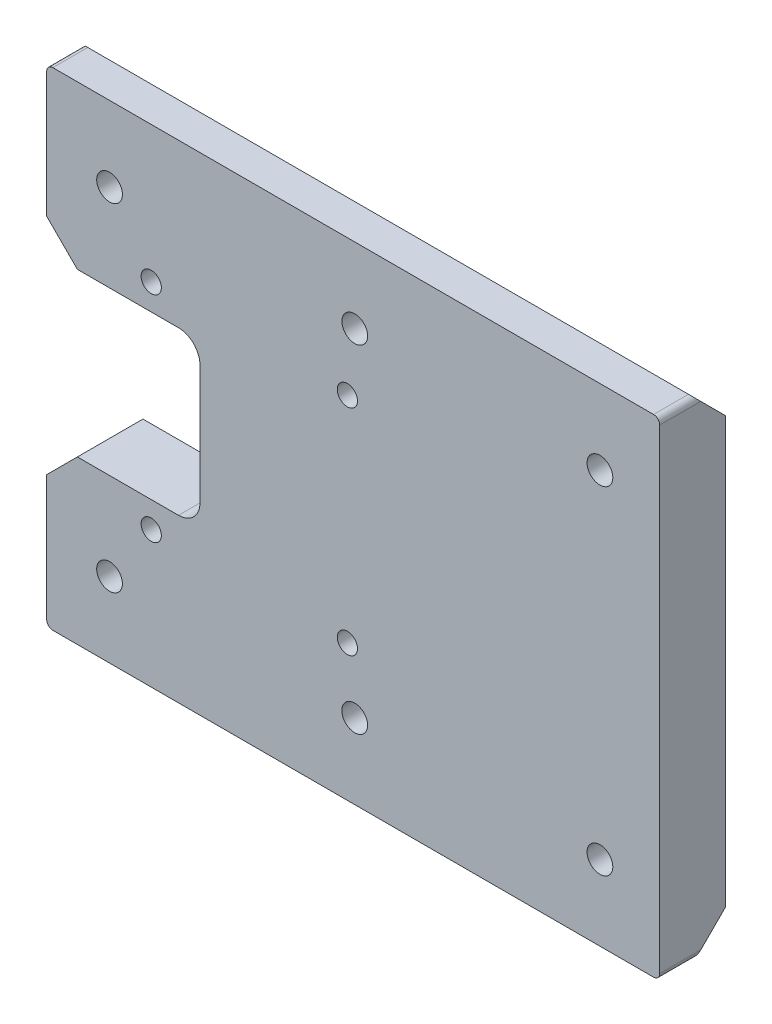
ISO-10303-21;
HEADER;
FILE_DESCRIPTION(('STEP AP214'),'2;1');
FILE_NAME('part.step','',(''),(''),'','','');
FILE_SCHEMA(('AUTOMOTIVE_DESIGN { 1 0 10303 214 1 1 1 1 }'));
ENDSEC;
DATA;
#1=APPLICATION_CONTEXT('core data for automotive mechanical design processes');
#2=APPLICATION_PROTOCOL_DEFINITION('international standard','automotive_design',2000,#1);
#3=PRODUCT_CONTEXT('',#1,'mechanical');
#4=PRODUCT('Part','Part','',(#3));
#5=PRODUCT_RELATED_PRODUCT_CATEGORY('part','',(#4));
#6=PRODUCT_DEFINITION_FORMATION('','',#4);
#7=PRODUCT_DEFINITION_CONTEXT('part definition',#1,'design');
#8=PRODUCT_DEFINITION('design','',#6,#7);
#9=PRODUCT_DEFINITION_SHAPE('','',#8);
#10=(LENGTH_UNIT() NAMED_UNIT(*) SI_UNIT(.MILLI.,.METRE.));
#11=(NAMED_UNIT(*) PLANE_ANGLE_UNIT() SI_UNIT($,.RADIAN.));
#12=(NAMED_UNIT(*) SI_UNIT($,.STERADIAN.) SOLID_ANGLE_UNIT());
#13=UNCERTAINTY_MEASURE_WITH_UNIT(LENGTH_MEASURE(1.E-05),#10,'distance_accuracy_value','');
#14=(GEOMETRIC_REPRESENTATION_CONTEXT(3) GLOBAL_UNCERTAINTY_ASSIGNED_CONTEXT((#13)) GLOBAL_UNIT_ASSIGNED_CONTEXT((#10,
#11,#12)) REPRESENTATION_CONTEXT('',''));
#15=CARTESIAN_POINT('',(0.,0.,0.));
#16=DIRECTION('',(0.,0.,1.));
#17=DIRECTION('',(1.,0.,0.));
#18=AXIS2_PLACEMENT_3D('',#15,#16,#17);
#19=CARTESIAN_POINT('',(1.,-38.75,12.7));
#20=DIRECTION('',(0.,0.,-1.));
#21=DIRECTION('',(-1.,0.,0.));
#22=AXIS2_PLACEMENT_3D('',#19,#20,#21);
#23=PLANE('',#22);
#24=CARTESIAN_POINT('',(17.05,-17.5,12.7));
#25=DIRECTION('',(0.,0.,1.));
#26=DIRECTION('',(1.,0.,0.));
#27=AXIS2_PLACEMENT_3D('',#24,#25,#26);
#28=CIRCLE('',#27,1.65);
#29=CARTESIAN_POINT('',(18.7,-17.5,12.7));
#30=VERTEX_POINT('',#29);
#31=EDGE_CURVE('E509',#30,#30,#28,.T.);
#32=ORIENTED_EDGE('',*,*,#31,.F.);
#33=EDGE_LOOP('',(#32));
#34=FACE_BOUND('',#33,.T.);
#35=CARTESIAN_POINT('',(90.25,27.5,12.7));
#36=DIRECTION('',(0.,0.,1.));
#37=DIRECTION('',(1.,0.,0.));
#38=AXIS2_PLACEMENT_3D('',#35,#36,#37);
#39=CIRCLE('',#38,2.1);
#40=CARTESIAN_POINT('',(92.35,27.5,12.7));
#41=VERTEX_POINT('',#40);
#42=EDGE_CURVE('E282',#41,#41,#39,.T.);
#43=ORIENTED_EDGE('',*,*,#42,.F.);
#44=EDGE_LOOP('',(#43));
#45=FACE_BOUND('',#44,.T.);
#46=CARTESIAN_POINT('',(90.25,-27.5,12.7));
#47=DIRECTION('',(0.,0.,1.));
#48=DIRECTION('',(1.,0.,0.));
#49=AXIS2_PLACEMENT_3D('',#46,#47,#48);
#50=CIRCLE('',#49,2.1);
#51=CARTESIAN_POINT('',(92.35,-27.5,12.7));
#52=VERTEX_POINT('',#51);
#53=EDGE_CURVE('E285',#52,#52,#50,.T.);
#54=ORIENTED_EDGE('',*,*,#53,.F.);
#55=EDGE_LOOP('',(#54));
#56=FACE_BOUND('',#55,.T.);
#57=CARTESIAN_POINT('',(50.25,-27.5,12.7));
#58=DIRECTION('',(0.,0.,1.));
#59=DIRECTION('',(1.,0.,0.));
#60=AXIS2_PLACEMENT_3D('',#57,#58,#59);
#61=CIRCLE('',#60,2.1);
#62=CARTESIAN_POINT('',(52.35,-27.5,12.7));
#63=VERTEX_POINT('',#62);
#64=EDGE_CURVE('E288',#63,#63,#61,.T.);
#65=ORIENTED_EDGE('',*,*,#64,.F.);
#66=EDGE_LOOP('',(#65));
#67=FACE_BOUND('',#66,.T.);
#68=CARTESIAN_POINT('',(10.25,-27.5,12.7));
#69=DIRECTION('',(0.,0.,1.));
#70=DIRECTION('',(1.,0.,0.));
#71=AXIS2_PLACEMENT_3D('',#68,#69,#70);
#72=CIRCLE('',#71,2.1);
#73=CARTESIAN_POINT('',(12.35,-27.5,12.7));
#74=VERTEX_POINT('',#73);
#75=EDGE_CURVE('E291',#74,#74,#72,.T.);
#76=ORIENTED_EDGE('',*,*,#75,.F.);
#77=EDGE_LOOP('',(#76));
#78=FACE_BOUND('',#77,.T.);
#79=DIRECTION('',(0.,-1.,0.));
#80=VECTOR('',#79,1.);
#81=CARTESIAN_POINT('',(0.,38.75,12.7));
#82=LINE('',#81,#80);
#83=CARTESIAN_POINT('',(0.,38.75,12.7));
#84=VERTEX_POINT('',#83);
#85=CARTESIAN_POINT('',(0.,18.25,12.7));
#86=VERTEX_POINT('',#85);
#87=EDGE_CURVE('E317',#84,#86,#82,.T.);
#88=ORIENTED_EDGE('',*,*,#87,.T.);
#89=DIRECTION('',(-0.707106781186546,0.707106781186549,0.));
#90=VECTOR('',#89,1.);
#91=CARTESIAN_POINT('',(5.00000000000001,13.25,12.7));
#92=LINE('',#91,#90);
#93=CARTESIAN_POINT('',(5.00000000000001,13.25,12.7));
#94=VERTEX_POINT('',#93);
#95=EDGE_CURVE('E340',#86,#94,#92,.F.);
#96=ORIENTED_EDGE('',*,*,#95,.T.);
#97=DIRECTION('',(1.,0.,0.));
#98=VECTOR('',#97,1.);
#99=CARTESIAN_POINT('',(0.,13.25,12.7));
#100=LINE('',#99,#98);
#101=CARTESIAN_POINT('',(21.5,13.25,12.7));
#102=VERTEX_POINT('',#101);
#103=EDGE_CURVE('E294',#94,#102,#100,.T.);
#104=ORIENTED_EDGE('',*,*,#103,.T.);
#105=CARTESIAN_POINT('',(21.5,9.75,12.7));
#106=DIRECTION('',(0.,0.,-1.));
#107=DIRECTION('',(-1.,0.,0.));
#108=AXIS2_PLACEMENT_3D('',#105,#106,#107);
#109=CIRCLE('',#108,3.5);
#110=CARTESIAN_POINT('',(25.,9.75,12.7));
#111=VERTEX_POINT('',#110);
#112=EDGE_CURVE('E187',#102,#111,#109,.T.);
#113=ORIENTED_EDGE('',*,*,#112,.T.);
#114=DIRECTION('',(0.,-1.,0.));
#115=VECTOR('',#114,1.);
#116=CARTESIAN_POINT('',(25.,13.25,12.7));
#117=LINE('',#116,#115);
#118=CARTESIAN_POINT('',(25.,-9.75,12.7));
#119=VERTEX_POINT('',#118);
#120=EDGE_CURVE('E296',#111,#119,#117,.T.);
#121=ORIENTED_EDGE('',*,*,#120,.T.);
#122=CARTESIAN_POINT('',(21.5,-9.75,12.7));
#123=DIRECTION('',(0.,0.,-1.));
#124=DIRECTION('',(-1.,0.,0.));
#125=AXIS2_PLACEMENT_3D('',#122,#123,#124);
#126=CIRCLE('',#125,3.5);
#127=CARTESIAN_POINT('',(21.5,-13.25,12.7));
#128=VERTEX_POINT('',#127);
#129=EDGE_CURVE('E188',#119,#128,#126,.T.);
#130=ORIENTED_EDGE('',*,*,#129,.T.);
#131=DIRECTION('',(-1.,0.,0.));
#132=VECTOR('',#131,1.);
#133=CARTESIAN_POINT('',(0.,-13.25,12.7));
#134=LINE('',#133,#132);
#135=CARTESIAN_POINT('',(5.00000000000002,-13.25,12.7));
#136=VERTEX_POINT('',#135);
#137=EDGE_CURVE('E299',#128,#136,#134,.T.);
#138=ORIENTED_EDGE('',*,*,#137,.T.);
#139=DIRECTION('',(0.70710678118655,0.707106781186546,0.));
#140=VECTOR('',#139,1.);
#141=CARTESIAN_POINT('',(0.,-18.25,12.7));
#142=LINE('',#141,#140);
#143=CARTESIAN_POINT('',(0.,-18.25,12.7));
#144=VERTEX_POINT('',#143);
#145=EDGE_CURVE('E338',#136,#144,#142,.F.);
#146=ORIENTED_EDGE('',*,*,#145,.T.);
#147=DIRECTION('',(0.,-1.,0.));
#148=VECTOR('',#147,1.);
#149=CARTESIAN_POINT('',(0.,-38.75,12.7));
#150=LINE('',#149,#148);
#151=CARTESIAN_POINT('',(0.,-38.75,12.7));
#152=VERTEX_POINT('',#151);
#153=EDGE_CURVE('E302',#144,#152,#150,.T.);
#154=ORIENTED_EDGE('',*,*,#153,.T.);
#155=CARTESIAN_POINT('',(1.,-38.75,12.7));
#156=DIRECTION('',(0.,0.,1.));
#157=DIRECTION('',(-1.,0.,0.));
#158=AXIS2_PLACEMENT_3D('',#155,#156,#157);
#159=CIRCLE('',#158,0.999999999999996);
#160=CARTESIAN_POINT('',(1.,-39.75,12.7));
#161=VERTEX_POINT('',#160);
#162=EDGE_CURVE('E304',#152,#161,#159,.T.);
#163=ORIENTED_EDGE('',*,*,#162,.T.);
#164=DIRECTION('',(1.,0.,0.));
#165=VECTOR('',#164,1.);
#166=CARTESIAN_POINT('',(1.,-39.75,12.7));
#167=LINE('',#166,#165);
#168=CARTESIAN_POINT('',(99.,-39.75,12.7));
#169=VERTEX_POINT('',#168);
#170=EDGE_CURVE('E306',#161,#169,#167,.T.);
#171=ORIENTED_EDGE('',*,*,#170,.T.);
#172=CARTESIAN_POINT('',(99.,-38.75,12.7));
#173=DIRECTION('',(0.,0.,1.));
#174=DIRECTION('',(1.,0.,0.));
#175=AXIS2_PLACEMENT_3D('',#172,#173,#174);
#176=CIRCLE('',#175,0.999999999999997);
#177=CARTESIAN_POINT('',(100.,-38.75,12.7));
#178=VERTEX_POINT('',#177);
#179=EDGE_CURVE('E308',#169,#178,#176,.T.);
#180=ORIENTED_EDGE('',*,*,#179,.T.);
#181=DIRECTION('',(0.,1.,0.));
#182=VECTOR('',#181,1.);
#183=CARTESIAN_POINT('',(100.,38.75,12.7));
#184=LINE('',#183,#182);
#185=CARTESIAN_POINT('',(100.,38.75,12.7));
#186=VERTEX_POINT('',#185);
#187=EDGE_CURVE('E310',#178,#186,#184,.T.);
#188=ORIENTED_EDGE('',*,*,#187,.T.);
#189=CARTESIAN_POINT('',(99.,38.75,12.7));
#190=DIRECTION('',(0.,0.,1.));
#191=DIRECTION('',(-1.,0.,0.));
#192=AXIS2_PLACEMENT_3D('',#189,#190,#191);
#193=CIRCLE('',#192,0.999999999999997);
#194=CARTESIAN_POINT('',(99.,39.75,12.7));
#195=VERTEX_POINT('',#194);
#196=EDGE_CURVE('E312',#186,#195,#193,.T.);
#197=ORIENTED_EDGE('',*,*,#196,.T.);
#198=DIRECTION('',(-1.,0.,0.));
#199=VECTOR('',#198,1.);
#200=CARTESIAN_POINT('',(1.,39.75,12.7));
#201=LINE('',#200,#199);
#202=CARTESIAN_POINT('',(1.,39.75,12.7));
#203=VERTEX_POINT('',#202);
#204=EDGE_CURVE('E234',#195,#203,#201,.T.);
#205=ORIENTED_EDGE('',*,*,#204,.T.);
#206=CARTESIAN_POINT('',(1.,38.75,12.7));
#207=DIRECTION('',(0.,0.,1.));
#208=DIRECTION('',(-1.,0.,0.));
#209=AXIS2_PLACEMENT_3D('',#206,#207,#208);
#210=CIRCLE('',#209,0.999999999999996);
#211=EDGE_CURVE('E315',#203,#84,#210,.T.);
#212=ORIENTED_EDGE('',*,*,#211,.T.);
#213=EDGE_LOOP('',(#88,#96,#104,#113,#121,#130,#138,#146,#154,#163,#171,#180,#188,#197,#205,#212));
#214=FACE_BOUND('',#213,.T.);
#215=CARTESIAN_POINT('',(50.25,27.5,12.7));
#216=DIRECTION('',(0.,0.,1.));
#217=DIRECTION('',(1.,0.,0.));
#218=AXIS2_PLACEMENT_3D('',#215,#216,#217);
#219=CIRCLE('',#218,2.1);
#220=CARTESIAN_POINT('',(52.35,27.5,12.7));
#221=VERTEX_POINT('',#220);
#222=EDGE_CURVE('E279',#221,#221,#219,.T.);
#223=ORIENTED_EDGE('',*,*,#222,.F.);
#224=EDGE_LOOP('',(#223));
#225=FACE_BOUND('',#224,.T.);
#226=CARTESIAN_POINT('',(10.25,27.5,12.7));
#227=DIRECTION('',(0.,0.,1.));
#228=DIRECTION('',(1.,0.,0.));
#229=AXIS2_PLACEMENT_3D('',#226,#227,#228);
#230=CIRCLE('',#229,2.1);
#231=CARTESIAN_POINT('',(12.35,27.5,12.7));
#232=VERTEX_POINT('',#231);
#233=EDGE_CURVE('E276',#232,#232,#230,.T.);
#234=ORIENTED_EDGE('',*,*,#233,.F.);
#235=EDGE_LOOP('',(#234));
#236=FACE_BOUND('',#235,.T.);
#237=CARTESIAN_POINT('',(49.05,17.5,12.7));
#238=DIRECTION('',(0.,0.,1.));
#239=DIRECTION('',(1.,0.,0.));
#240=AXIS2_PLACEMENT_3D('',#237,#238,#239);
#241=CIRCLE('',#240,1.65);
#242=CARTESIAN_POINT('',(50.7,17.5,12.7));
#243=VERTEX_POINT('',#242);
#244=EDGE_CURVE('E520',#243,#243,#241,.T.);
#245=ORIENTED_EDGE('',*,*,#244,.F.);
#246=EDGE_LOOP('',(#245));
#247=FACE_BOUND('',#246,.T.);
#248=CARTESIAN_POINT('',(49.05,-17.5,12.7));
#249=DIRECTION('',(0.,0.,1.));
#250=DIRECTION('',(1.,0.,0.));
#251=AXIS2_PLACEMENT_3D('',#248,#249,#250);
#252=CIRCLE('',#251,1.65);
#253=CARTESIAN_POINT('',(50.7,-17.5,12.7));
#254=VERTEX_POINT('',#253);
#255=EDGE_CURVE('E517',#254,#254,#252,.T.);
#256=ORIENTED_EDGE('',*,*,#255,.F.);
#257=EDGE_LOOP('',(#256));
#258=FACE_BOUND('',#257,.T.);
#259=CARTESIAN_POINT('',(17.05,17.5,12.7));
#260=DIRECTION('',(0.,0.,1.));
#261=DIRECTION('',(1.,0.,0.));
#262=AXIS2_PLACEMENT_3D('',#259,#260,#261);
#263=CIRCLE('',#262,1.65);
#264=CARTESIAN_POINT('',(18.7,17.5,12.7));
#265=VERTEX_POINT('',#264);
#266=EDGE_CURVE('E506',#265,#265,#263,.T.);
#267=ORIENTED_EDGE('',*,*,#266,.F.);
#268=EDGE_LOOP('',(#267));
#269=FACE_BOUND('',#268,.T.);
#270=ADVANCED_FACE('F34',(#34,#45,#56,#67,#78,#214,#225,#236,#247,#258,#269),#23,.F.);
#271=CARTESIAN_POINT('',(0.,13.25,12.7));
#272=DIRECTION('',(0.,1.,0.));
#273=DIRECTION('',(0.,0.,1.));
#274=AXIS2_PLACEMENT_3D('',#271,#272,#273);
#275=PLANE('',#274);
#276=DIRECTION('',(-1.,0.,0.));
#277=VECTOR('',#276,1.);
#278=CARTESIAN_POINT('',(21.5,13.25,2.));
#279=LINE('',#278,#277);
#280=CARTESIAN_POINT('',(21.5,13.25,2.));
#281=VERTEX_POINT('',#280);
#282=CARTESIAN_POINT('',(5.00000000000001,13.25,2.));
#283=VERTEX_POINT('',#282);
#284=EDGE_CURVE('E165',#281,#283,#279,.T.);
#285=ORIENTED_EDGE('',*,*,#284,.F.);
#286=DIRECTION('',(0.,0.,-1.));
#287=VECTOR('',#286,1.);
#288=CARTESIAN_POINT('',(21.5,13.25,12.7));
#289=LINE('',#288,#287);
#290=EDGE_CURVE('E179',#281,#102,#289,.F.);
#291=ORIENTED_EDGE('',*,*,#290,.T.);
#292=ORIENTED_EDGE('',*,*,#103,.F.);
#293=DIRECTION('',(0.,0.,-1.));
#294=VECTOR('',#293,1.);
#295=CARTESIAN_POINT('',(5.00000000000001,13.25,12.7));
#296=LINE('',#295,#294);
#297=EDGE_CURVE('E182',#94,#283,#296,.T.);
#298=ORIENTED_EDGE('',*,*,#297,.T.);
#299=EDGE_LOOP('',(#285,#291,#292,#298));
#300=FACE_BOUND('',#299,.T.);
#301=ADVANCED_FACE('F177',(#300),#275,.F.);
#302=CARTESIAN_POINT('',(25.,13.25,12.7));
#303=DIRECTION('',(1.,0.,0.));
#304=DIRECTION('',(0.,0.,-1.));
#305=AXIS2_PLACEMENT_3D('',#302,#303,#304);
#306=PLANE('',#305);
#307=DIRECTION('',(0.,1.,0.));
#308=VECTOR('',#307,1.);
#309=CARTESIAN_POINT('',(25.,-9.75,2.));
#310=LINE('',#309,#308);
#311=CARTESIAN_POINT('',(25.,-9.75,2.));
#312=VERTEX_POINT('',#311);
#313=CARTESIAN_POINT('',(25.,9.75,2.));
#314=VERTEX_POINT('',#313);
#315=EDGE_CURVE('E168',#312,#314,#310,.T.);
#316=ORIENTED_EDGE('',*,*,#315,.F.);
#317=DIRECTION('',(0.,0.,-1.));
#318=VECTOR('',#317,1.);
#319=CARTESIAN_POINT('',(25.,-9.75,12.7));
#320=LINE('',#319,#318);
#321=EDGE_CURVE('E189',#312,#119,#320,.F.);
#322=ORIENTED_EDGE('',*,*,#321,.T.);
#323=ORIENTED_EDGE('',*,*,#120,.F.);
#324=DIRECTION('',(0.,0.,-1.));
#325=VECTOR('',#324,1.);
#326=CARTESIAN_POINT('',(25.,9.75,0.));
#327=LINE('',#326,#325);
#328=EDGE_CURVE('E192',#111,#314,#327,.T.);
#329=ORIENTED_EDGE('',*,*,#328,.T.);
#330=EDGE_LOOP('',(#316,#322,#323,#329));
#331=FACE_BOUND('',#330,.T.);
#332=ADVANCED_FACE('F351',(#331),#306,.F.);
#333=CARTESIAN_POINT('',(0.,-13.25,12.7));
#334=DIRECTION('',(0.,-1.,0.));
#335=DIRECTION('',(0.,0.,-1.));
#336=AXIS2_PLACEMENT_3D('',#333,#334,#335);
#337=PLANE('',#336);
#338=DIRECTION('',(1.,0.,0.));
#339=VECTOR('',#338,1.);
#340=CARTESIAN_POINT('',(5.00000000000002,-13.25,2.));
#341=LINE('',#340,#339);
#342=CARTESIAN_POINT('',(5.00000000000002,-13.25,2.));
#343=VERTEX_POINT('',#342);
#344=CARTESIAN_POINT('',(21.5,-13.25,2.));
#345=VERTEX_POINT('',#344);
#346=EDGE_CURVE('E257',#343,#345,#341,.T.);
#347=ORIENTED_EDGE('',*,*,#346,.F.);
#348=DIRECTION('',(0.,0.,1.));
#349=VECTOR('',#348,1.);
#350=CARTESIAN_POINT('',(5.00000000000002,-13.25,12.7));
#351=LINE('',#350,#349);
#352=EDGE_CURVE('E345',#343,#136,#351,.T.);
#353=ORIENTED_EDGE('',*,*,#352,.T.);
#354=ORIENTED_EDGE('',*,*,#137,.F.);
#355=DIRECTION('',(0.,0.,-1.));
#356=VECTOR('',#355,1.);
#357=CARTESIAN_POINT('',(21.5,-13.25,0.));
#358=LINE('',#357,#356);
#359=EDGE_CURVE('E347',#128,#345,#358,.T.);
#360=ORIENTED_EDGE('',*,*,#359,.T.);
#361=EDGE_LOOP('',(#347,#353,#354,#360));
#362=FACE_BOUND('',#361,.T.);
#363=ADVANCED_FACE('F363',(#362),#337,.F.);
#364=CARTESIAN_POINT('',(0.,-38.75,12.7));
#365=DIRECTION('',(1.,0.,0.));
#366=DIRECTION('',(0.,1.,0.));
#367=AXIS2_PLACEMENT_3D('',#364,#365,#366);
#368=PLANE('',#367);
#369=DIRECTION('',(0.,1.,0.));
#370=VECTOR('',#369,1.);
#371=CARTESIAN_POINT('',(0.,-38.75,2.));
#372=LINE('',#371,#370);
#373=CARTESIAN_POINT('',(0.,-34.75,2.));
#374=VERTEX_POINT('',#373);
#375=CARTESIAN_POINT('',(0.,-18.25,2.));
#376=VERTEX_POINT('',#375);
#377=EDGE_CURVE('E250',#374,#376,#372,.T.);
#378=ORIENTED_EDGE('',*,*,#377,.F.);
#379=DIRECTION('',(0.,-0.707106781186545,0.70710678118655));
#380=VECTOR('',#379,1.);
#381=CARTESIAN_POINT('',(0.,-34.75,2.));
#382=LINE('',#381,#380);
#383=CARTESIAN_POINT('',(0.,-38.75,6.00000000000004));
#384=VERTEX_POINT('',#383);
#385=EDGE_CURVE('E207',#374,#384,#382,.T.);
#386=ORIENTED_EDGE('',*,*,#385,.T.);
#387=DIRECTION('',(0.,0.,-1.));
#388=VECTOR('',#387,1.);
#389=CARTESIAN_POINT('',(0.,-38.75,12.7));
#390=LINE('',#389,#388);
#391=EDGE_CURVE('E332',#152,#384,#390,.T.);
#392=ORIENTED_EDGE('',*,*,#391,.F.);
#393=ORIENTED_EDGE('',*,*,#153,.F.);
#394=DIRECTION('',(0.,0.,-1.));
#395=VECTOR('',#394,1.);
#396=CARTESIAN_POINT('',(0.,-18.25,12.7));
#397=LINE('',#396,#395);
#398=EDGE_CURVE('E342',#144,#376,#397,.T.);
#399=ORIENTED_EDGE('',*,*,#398,.T.);
#400=EDGE_LOOP('',(#378,#386,#392,#393,#399));
#401=FACE_BOUND('',#400,.T.);
#402=ADVANCED_FACE('F373',(#401),#368,.F.);
#403=CARTESIAN_POINT('',(1.,-38.75,12.7));
#404=DIRECTION('',(0.,0.,-1.));
#405=DIRECTION('',(-1.,0.,0.));
#406=AXIS2_PLACEMENT_3D('',#403,#404,#405);
#407=CYLINDRICAL_SURFACE('',#406,0.999999999999996);
#408=ORIENTED_EDGE('',*,*,#391,.T.);
#409=CARTESIAN_POINT('',(1.,-38.75,6.00000000000004));
#410=DIRECTION('',(0.,-0.70710678118655,-0.707106781186545));
#411=DIRECTION('',(0.,0.707106781186545,-0.70710678118655));
#412=AXIS2_PLACEMENT_3D('',#409,#410,#411);
#413=ELLIPSE('',#412,1.41421356237309,0.999999999999996);
#414=CARTESIAN_POINT('',(1.,-39.75,7.00000000000005));
#415=VERTEX_POINT('',#414);
#416=EDGE_CURVE('E209',#384,#415,#413,.F.);
#417=ORIENTED_EDGE('',*,*,#416,.T.);
#418=DIRECTION('',(0.,0.,-1.));
#419=VECTOR('',#418,1.);
#420=CARTESIAN_POINT('',(1.,-39.75,12.7));
#421=LINE('',#420,#419);
#422=EDGE_CURVE('E329',#161,#415,#421,.T.);
#423=ORIENTED_EDGE('',*,*,#422,.F.);
#424=ORIENTED_EDGE('',*,*,#162,.F.);
#425=EDGE_LOOP('',(#408,#417,#423,#424));
#426=FACE_BOUND('',#425,.T.);
#427=ADVANCED_FACE('F380',(#426),#407,.T.);
#428=CARTESIAN_POINT('',(1.,-39.75,12.7));
#429=DIRECTION('',(0.,1.,0.));
#430=DIRECTION('',(-1.,0.,0.));
#431=AXIS2_PLACEMENT_3D('',#428,#429,#430);
#432=PLANE('',#431);
#433=ORIENTED_EDGE('',*,*,#422,.T.);
#434=DIRECTION('',(1.,0.,0.));
#435=VECTOR('',#434,1.);
#436=CARTESIAN_POINT('',(99.,-39.75,7.00000000000005));
#437=LINE('',#436,#435);
#438=CARTESIAN_POINT('',(99.,-39.75,7.00000000000005));
#439=VERTEX_POINT('',#438);
#440=EDGE_CURVE('E211',#415,#439,#437,.T.);
#441=ORIENTED_EDGE('',*,*,#440,.T.);
#442=DIRECTION('',(0.,0.,-1.));
#443=VECTOR('',#442,1.);
#444=CARTESIAN_POINT('',(99.,-39.75,12.7));
#445=LINE('',#444,#443);
#446=EDGE_CURVE('E326',#169,#439,#445,.T.);
#447=ORIENTED_EDGE('',*,*,#446,.F.);
#448=ORIENTED_EDGE('',*,*,#170,.F.);
#449=EDGE_LOOP('',(#433,#441,#447,#448));
#450=FACE_BOUND('',#449,.T.);
#451=ADVANCED_FACE('F384',(#450),#432,.F.);
#452=CARTESIAN_POINT('',(99.,-38.75,12.7));
#453=DIRECTION('',(0.,0.,-1.));
#454=DIRECTION('',(-1.,0.,0.));
#455=AXIS2_PLACEMENT_3D('',#452,#453,#454);
#456=CYLINDRICAL_SURFACE('',#455,0.999999999999997);
#457=ORIENTED_EDGE('',*,*,#446,.T.);
#458=CARTESIAN_POINT('',(99.,-38.75,6.00000000000005));
#459=DIRECTION('',(0.,-0.70710678118655,-0.707106781186545));
#460=DIRECTION('',(0.,0.707106781186545,-0.70710678118655));
#461=AXIS2_PLACEMENT_3D('',#458,#459,#460);
#462=ELLIPSE('',#461,1.4142135623731,0.999999999999997);
#463=CARTESIAN_POINT('',(100.,-38.75,6.00000000000004));
#464=VERTEX_POINT('',#463);
#465=EDGE_CURVE('E213',#439,#464,#462,.F.);
#466=ORIENTED_EDGE('',*,*,#465,.T.);
#467=DIRECTION('',(0.,0.,-1.));
#468=VECTOR('',#467,1.);
#469=CARTESIAN_POINT('',(100.,-38.75,12.7));
#470=LINE('',#469,#468);
#471=EDGE_CURVE('E323',#178,#464,#470,.T.);
#472=ORIENTED_EDGE('',*,*,#471,.F.);
#473=ORIENTED_EDGE('',*,*,#179,.F.);
#474=EDGE_LOOP('',(#457,#466,#472,#473));
#475=FACE_BOUND('',#474,.T.);
#476=ADVANCED_FACE('F389',(#475),#456,.T.);
#477=CARTESIAN_POINT('',(100.,38.75,12.7));
#478=DIRECTION('',(-1.,0.,0.));
#479=DIRECTION('',(0.,0.,1.));
#480=AXIS2_PLACEMENT_3D('',#477,#478,#479);
#481=PLANE('',#480);
#482=ORIENTED_EDGE('',*,*,#471,.T.);
#483=DIRECTION('',(0.,0.707106781186545,-0.70710678118655));
#484=VECTOR('',#483,1.);
#485=CARTESIAN_POINT('',(100.,-34.75,2.));
#486=LINE('',#485,#484);
#487=CARTESIAN_POINT('',(100.,-34.75,2.));
#488=VERTEX_POINT('',#487);
#489=EDGE_CURVE('E217',#464,#488,#486,.T.);
#490=ORIENTED_EDGE('',*,*,#489,.T.);
#491=DIRECTION('',(0.,-1.,0.));
#492=VECTOR('',#491,1.);
#493=CARTESIAN_POINT('',(100.,38.75,2.));
#494=LINE('',#493,#492);
#495=CARTESIAN_POINT('',(100.,34.75,2.));
#496=VERTEX_POINT('',#495);
#497=EDGE_CURVE('E248',#496,#488,#494,.T.);
#498=ORIENTED_EDGE('',*,*,#497,.F.);
#499=DIRECTION('',(0.,0.707106781186545,0.70710678118655));
#500=VECTOR('',#499,1.);
#501=CARTESIAN_POINT('',(100.,34.75,2.));
#502=LINE('',#501,#500);
#503=CARTESIAN_POINT('',(100.,38.75,6.00000000000005));
#504=VERTEX_POINT('',#503);
#505=EDGE_CURVE('E215',#496,#504,#502,.T.);
#506=ORIENTED_EDGE('',*,*,#505,.T.);
#507=DIRECTION('',(0.,0.,-1.));
#508=VECTOR('',#507,1.);
#509=CARTESIAN_POINT('',(100.,38.75,12.7));
#510=LINE('',#509,#508);
#511=EDGE_CURVE('E231',#186,#504,#510,.T.);
#512=ORIENTED_EDGE('',*,*,#511,.F.);
#513=ORIENTED_EDGE('',*,*,#187,.F.);
#514=EDGE_LOOP('',(#482,#490,#498,#506,#512,#513));
#515=FACE_BOUND('',#514,.T.);
#516=ADVANCED_FACE('F392',(#515),#481,.F.);
#517=CARTESIAN_POINT('',(99.,38.75,12.7));
#518=DIRECTION('',(0.,0.,-1.));
#519=DIRECTION('',(-1.,0.,0.));
#520=AXIS2_PLACEMENT_3D('',#517,#518,#519);
#521=CYLINDRICAL_SURFACE('',#520,0.999999999999997);
#522=ORIENTED_EDGE('',*,*,#511,.T.);
#523=CARTESIAN_POINT('',(99.,38.75,6.00000000000005));
#524=DIRECTION('',(0.,0.70710678118655,-0.707106781186545));
#525=DIRECTION('',(0.,-0.707106781186545,-0.70710678118655));
#526=AXIS2_PLACEMENT_3D('',#523,#524,#525);
#527=ELLIPSE('',#526,1.4142135623731,0.999999999999997);
#528=CARTESIAN_POINT('',(99.,39.75,7.00000000000005));
#529=VERTEX_POINT('',#528);
#530=EDGE_CURVE('E219',#504,#529,#527,.F.);
#531=ORIENTED_EDGE('',*,*,#530,.T.);
#532=DIRECTION('',(0.,0.,-1.));
#533=VECTOR('',#532,1.);
#534=CARTESIAN_POINT('',(99.,39.75,12.7));
#535=LINE('',#534,#533);
#536=EDGE_CURVE('E228',#195,#529,#535,.T.);
#537=ORIENTED_EDGE('',*,*,#536,.F.);
#538=ORIENTED_EDGE('',*,*,#196,.F.);
#539=EDGE_LOOP('',(#522,#531,#537,#538));
#540=FACE_BOUND('',#539,.T.);
#541=ADVANCED_FACE('F226',(#540),#521,.T.);
#542=CARTESIAN_POINT('',(1.,39.75,12.7));
#543=DIRECTION('',(0.,-1.,0.));
#544=DIRECTION('',(1.,0.,0.));
#545=AXIS2_PLACEMENT_3D('',#542,#543,#544);
#546=PLANE('',#545);
#547=ORIENTED_EDGE('',*,*,#536,.T.);
#548=DIRECTION('',(-1.,0.,0.));
#549=VECTOR('',#548,1.);
#550=CARTESIAN_POINT('',(1.,39.75,7.00000000000005));
#551=LINE('',#550,#549);
#552=CARTESIAN_POINT('',(1.,39.75,7.00000000000004));
#553=VERTEX_POINT('',#552);
#554=EDGE_CURVE('E57',#529,#553,#551,.T.);
#555=ORIENTED_EDGE('',*,*,#554,.T.);
#556=DIRECTION('',(0.,0.,-1.));
#557=VECTOR('',#556,1.);
#558=CARTESIAN_POINT('',(1.,39.75,12.7));
#559=LINE('',#558,#557);
#560=EDGE_CURVE('E235',#203,#553,#559,.T.);
#561=ORIENTED_EDGE('',*,*,#560,.F.);
#562=ORIENTED_EDGE('',*,*,#204,.F.);
#563=EDGE_LOOP('',(#547,#555,#561,#562));
#564=FACE_BOUND('',#563,.T.);
#565=ADVANCED_FACE('F233',(#564),#546,.F.);
#566=CARTESIAN_POINT('',(1.,38.75,12.7));
#567=DIRECTION('',(0.,0.,-1.));
#568=DIRECTION('',(-1.,0.,0.));
#569=AXIS2_PLACEMENT_3D('',#566,#567,#568);
#570=CYLINDRICAL_SURFACE('',#569,0.999999999999996);
#571=ORIENTED_EDGE('',*,*,#560,.T.);
#572=CARTESIAN_POINT('',(1.,38.75,6.00000000000004));
#573=DIRECTION('',(0.,0.70710678118655,-0.707106781186545));
#574=DIRECTION('',(0.,-0.707106781186545,-0.70710678118655));
#575=AXIS2_PLACEMENT_3D('',#572,#573,#574);
#576=ELLIPSE('',#575,1.41421356237309,0.999999999999996);
#577=CARTESIAN_POINT('',(0.,38.75,6.00000000000004));
#578=VERTEX_POINT('',#577);
#579=EDGE_CURVE('E43',#553,#578,#576,.F.);
#580=ORIENTED_EDGE('',*,*,#579,.T.);
#581=DIRECTION('',(0.,0.,-1.));
#582=VECTOR('',#581,1.);
#583=CARTESIAN_POINT('',(0.,38.75,12.7));
#584=LINE('',#583,#582);
#585=EDGE_CURVE('E246',#84,#578,#584,.T.);
#586=ORIENTED_EDGE('',*,*,#585,.F.);
#587=ORIENTED_EDGE('',*,*,#211,.F.);
#588=EDGE_LOOP('',(#571,#580,#586,#587));
#589=FACE_BOUND('',#588,.T.);
#590=ADVANCED_FACE('F423',(#589),#570,.T.);
#591=CARTESIAN_POINT('',(0.,38.75,12.7));
#592=DIRECTION('',(1.,0.,0.));
#593=DIRECTION('',(0.,1.,0.));
#594=AXIS2_PLACEMENT_3D('',#591,#592,#593);
#595=PLANE('',#594);
#596=ORIENTED_EDGE('',*,*,#585,.T.);
#597=DIRECTION('',(0.,-0.707106781186545,-0.70710678118655));
#598=VECTOR('',#597,1.);
#599=CARTESIAN_POINT('',(0.,34.75,2.));
#600=LINE('',#599,#598);
#601=CARTESIAN_POINT('',(0.,34.75,2.));
#602=VERTEX_POINT('',#601);
#603=EDGE_CURVE('E11',#578,#602,#600,.T.);
#604=ORIENTED_EDGE('',*,*,#603,.T.);
#605=DIRECTION('',(0.,1.,0.));
#606=VECTOR('',#605,1.);
#607=CARTESIAN_POINT('',(0.,18.25,2.));
#608=LINE('',#607,#606);
#609=CARTESIAN_POINT('',(0.,18.25,2.));
#610=VERTEX_POINT('',#609);
#611=EDGE_CURVE('E243',#610,#602,#608,.T.);
#612=ORIENTED_EDGE('',*,*,#611,.F.);
#613=DIRECTION('',(0.,0.,1.));
#614=VECTOR('',#613,1.);
#615=CARTESIAN_POINT('',(0.,18.25,12.7));
#616=LINE('',#615,#614);
#617=EDGE_CURVE('E336',#610,#86,#616,.T.);
#618=ORIENTED_EDGE('',*,*,#617,.T.);
#619=ORIENTED_EDGE('',*,*,#87,.F.);
#620=EDGE_LOOP('',(#596,#604,#612,#618,#619));
#621=FACE_BOUND('',#620,.T.);
#622=ADVANCED_FACE('F242',(#621),#595,.F.);
#623=CARTESIAN_POINT('',(5.00000000000001,13.25,12.7));
#624=DIRECTION('',(0.707106781186549,0.707106781186545,0.));
#625=DIRECTION('',(0.,0.,-1.));
#626=AXIS2_PLACEMENT_3D('',#623,#624,#625);
#627=PLANE('',#626);
#628=ORIENTED_EDGE('',*,*,#617,.F.);
#629=DIRECTION('',(-0.707106781186546,0.707106781186549,0.));
#630=VECTOR('',#629,1.);
#631=CARTESIAN_POINT('',(5.00000000000001,13.25,2.));
#632=LINE('',#631,#630);
#633=EDGE_CURVE('E183',#283,#610,#632,.T.);
#634=ORIENTED_EDGE('',*,*,#633,.F.);
#635=ORIENTED_EDGE('',*,*,#297,.F.);
#636=ORIENTED_EDGE('',*,*,#95,.F.);
#637=EDGE_LOOP('',(#628,#634,#635,#636));
#638=FACE_BOUND('',#637,.T.);
#639=ADVANCED_FACE('F422',(#638),#627,.F.);
#640=CARTESIAN_POINT('',(0.,-18.25,12.7));
#641=DIRECTION('',(0.707106781186545,-0.707106781186549,0.));
#642=DIRECTION('',(0.,0.,-1.));
#643=AXIS2_PLACEMENT_3D('',#640,#641,#642);
#644=PLANE('',#643);
#645=ORIENTED_EDGE('',*,*,#352,.F.);
#646=DIRECTION('',(0.707106781186549,0.707106781186546,0.));
#647=VECTOR('',#646,1.);
#648=CARTESIAN_POINT('',(0.,-18.25,2.));
#649=LINE('',#648,#647);
#650=EDGE_CURVE('E255',#376,#343,#649,.T.);
#651=ORIENTED_EDGE('',*,*,#650,.F.);
#652=ORIENTED_EDGE('',*,*,#398,.F.);
#653=ORIENTED_EDGE('',*,*,#145,.F.);
#654=EDGE_LOOP('',(#645,#651,#652,#653));
#655=FACE_BOUND('',#654,.T.);
#656=ADVANCED_FACE('F369',(#655),#644,.F.);
#657=CARTESIAN_POINT('',(21.5,-9.75,12.7));
#658=DIRECTION('',(0.,0.,1.));
#659=DIRECTION('',(1.,0.,0.));
#660=AXIS2_PLACEMENT_3D('',#657,#658,#659);
#661=CYLINDRICAL_SURFACE('',#660,3.5);
#662=CARTESIAN_POINT('',(21.5,-9.75,2.));
#663=DIRECTION('',(0.,0.,1.));
#664=DIRECTION('',(-1.,0.,0.));
#665=AXIS2_PLACEMENT_3D('',#662,#663,#664);
#666=CIRCLE('',#665,3.5);
#667=EDGE_CURVE('E259',#345,#312,#666,.T.);
#668=ORIENTED_EDGE('',*,*,#667,.F.);
#669=ORIENTED_EDGE('',*,*,#359,.F.);
#670=ORIENTED_EDGE('',*,*,#129,.F.);
#671=ORIENTED_EDGE('',*,*,#321,.F.);
#672=EDGE_LOOP('',(#668,#669,#670,#671));
#673=FACE_BOUND('',#672,.T.);
#674=ADVANCED_FACE('F360',(#673),#661,.F.);
#675=CARTESIAN_POINT('',(21.5,9.75,12.7));
#676=DIRECTION('',(0.,0.,1.));
#677=DIRECTION('',(1.,0.,0.));
#678=AXIS2_PLACEMENT_3D('',#675,#676,#677);
#679=CYLINDRICAL_SURFACE('',#678,3.5);
#680=CARTESIAN_POINT('',(21.5,9.75,2.));
#681=DIRECTION('',(0.,0.,1.));
#682=DIRECTION('',(-1.,0.,0.));
#683=AXIS2_PLACEMENT_3D('',#680,#681,#682);
#684=CIRCLE('',#683,3.5);
#685=EDGE_CURVE('E160',#314,#281,#684,.T.);
#686=ORIENTED_EDGE('',*,*,#685,.F.);
#687=ORIENTED_EDGE('',*,*,#328,.F.);
#688=ORIENTED_EDGE('',*,*,#112,.F.);
#689=ORIENTED_EDGE('',*,*,#290,.F.);
#690=EDGE_LOOP('',(#686,#687,#688,#689));
#691=FACE_BOUND('',#690,.T.);
#692=ADVANCED_FACE('F186',(#691),#679,.F.);
#693=CARTESIAN_POINT('',(10.25,-27.5,12.7));
#694=DIRECTION('',(0.,0.,1.));
#695=DIRECTION('',(1.,0.,0.));
#696=AXIS2_PLACEMENT_3D('',#693,#694,#695);
#697=CYLINDRICAL_SURFACE('',#696,2.1);
#698=ORIENTED_EDGE('',*,*,#75,.T.);
#699=EDGE_LOOP('',(#698));
#700=FACE_BOUND('',#699,.T.);
#701=CARTESIAN_POINT('',(10.25,-27.5,2.));
#702=DIRECTION('',(0.,0.,-1.));
#703=DIRECTION('',(-1.,0.,0.));
#704=AXIS2_PLACEMENT_3D('',#701,#702,#703);
#705=CIRCLE('',#704,2.1);
#706=CARTESIAN_POINT('',(8.15000000000003,-27.5,2.));
#707=VERTEX_POINT('',#706);
#708=EDGE_CURVE('E273',#707,#707,#705,.F.);
#709=ORIENTED_EDGE('',*,*,#708,.F.);
#710=EDGE_LOOP('',(#709));
#711=FACE_BOUND('',#710,.T.);
#712=ADVANCED_FACE('F418',(#700,#711),#697,.F.);
#713=CARTESIAN_POINT('',(50.25,-27.5,12.7));
#714=DIRECTION('',(0.,0.,1.));
#715=DIRECTION('',(1.,0.,0.));
#716=AXIS2_PLACEMENT_3D('',#713,#714,#715);
#717=CYLINDRICAL_SURFACE('',#716,2.1);
#718=ORIENTED_EDGE('',*,*,#64,.T.);
#719=EDGE_LOOP('',(#718));
#720=FACE_BOUND('',#719,.T.);
#721=CARTESIAN_POINT('',(50.25,-27.5,2.));
#722=DIRECTION('',(0.,0.,-1.));
#723=DIRECTION('',(-1.,0.,0.));
#724=AXIS2_PLACEMENT_3D('',#721,#722,#723);
#725=CIRCLE('',#724,2.1);
#726=CARTESIAN_POINT('',(48.15,-27.5,2.));
#727=VERTEX_POINT('',#726);
#728=EDGE_CURVE('E270',#727,#727,#725,.F.);
#729=ORIENTED_EDGE('',*,*,#728,.F.);
#730=EDGE_LOOP('',(#729));
#731=FACE_BOUND('',#730,.T.);
#732=ADVANCED_FACE('F454',(#720,#731),#717,.F.);
#733=CARTESIAN_POINT('',(90.25,-27.5,12.7));
#734=DIRECTION('',(0.,0.,1.));
#735=DIRECTION('',(1.,0.,0.));
#736=AXIS2_PLACEMENT_3D('',#733,#734,#735);
#737=CYLINDRICAL_SURFACE('',#736,2.1);
#738=ORIENTED_EDGE('',*,*,#53,.T.);
#739=EDGE_LOOP('',(#738));
#740=FACE_BOUND('',#739,.T.);
#741=CARTESIAN_POINT('',(90.25,-27.5,2.));
#742=DIRECTION('',(0.,0.,-1.));
#743=DIRECTION('',(-1.,0.,0.));
#744=AXIS2_PLACEMENT_3D('',#741,#742,#743);
#745=CIRCLE('',#744,2.1);
#746=CARTESIAN_POINT('',(88.15,-27.5,2.));
#747=VERTEX_POINT('',#746);
#748=EDGE_CURVE('E267',#747,#747,#745,.F.);
#749=ORIENTED_EDGE('',*,*,#748,.F.);
#750=EDGE_LOOP('',(#749));
#751=FACE_BOUND('',#750,.T.);
#752=ADVANCED_FACE('F459',(#740,#751),#737,.F.);
#753=CARTESIAN_POINT('',(90.25,27.5,12.7));
#754=DIRECTION('',(0.,0.,1.));
#755=DIRECTION('',(1.,0.,0.));
#756=AXIS2_PLACEMENT_3D('',#753,#754,#755);
#757=CYLINDRICAL_SURFACE('',#756,2.1);
#758=ORIENTED_EDGE('',*,*,#42,.T.);
#759=EDGE_LOOP('',(#758));
#760=FACE_BOUND('',#759,.T.);
#761=CARTESIAN_POINT('',(90.25,27.5,2.));
#762=DIRECTION('',(0.,0.,-1.));
#763=DIRECTION('',(-1.,0.,0.));
#764=AXIS2_PLACEMENT_3D('',#761,#762,#763);
#765=CIRCLE('',#764,2.1);
#766=CARTESIAN_POINT('',(88.15,27.5,2.));
#767=VERTEX_POINT('',#766);
#768=EDGE_CURVE('E264',#767,#767,#765,.F.);
#769=ORIENTED_EDGE('',*,*,#768,.F.);
#770=EDGE_LOOP('',(#769));
#771=FACE_BOUND('',#770,.T.);
#772=ADVANCED_FACE('F469',(#760,#771),#757,.F.);
#773=CARTESIAN_POINT('',(50.25,27.5,12.7));
#774=DIRECTION('',(0.,0.,1.));
#775=DIRECTION('',(1.,0.,0.));
#776=AXIS2_PLACEMENT_3D('',#773,#774,#775);
#777=CYLINDRICAL_SURFACE('',#776,2.1);
#778=ORIENTED_EDGE('',*,*,#222,.T.);
#779=EDGE_LOOP('',(#778));
#780=FACE_BOUND('',#779,.T.);
#781=CARTESIAN_POINT('',(50.25,27.5,2.));
#782=DIRECTION('',(0.,0.,-1.));
#783=DIRECTION('',(-1.,0.,0.));
#784=AXIS2_PLACEMENT_3D('',#781,#782,#783);
#785=CIRCLE('',#784,2.1);
#786=CARTESIAN_POINT('',(48.15,27.5,2.));
#787=VERTEX_POINT('',#786);
#788=EDGE_CURVE('E201',#787,#787,#785,.F.);
#789=ORIENTED_EDGE('',*,*,#788,.F.);
#790=EDGE_LOOP('',(#789));
#791=FACE_BOUND('',#790,.T.);
#792=ADVANCED_FACE('F476',(#780,#791),#777,.F.);
#793=CARTESIAN_POINT('',(10.25,27.5,12.7));
#794=DIRECTION('',(0.,0.,1.));
#795=DIRECTION('',(1.,0.,0.));
#796=AXIS2_PLACEMENT_3D('',#793,#794,#795);
#797=CYLINDRICAL_SURFACE('',#796,2.1);
#798=ORIENTED_EDGE('',*,*,#233,.T.);
#799=EDGE_LOOP('',(#798));
#800=FACE_BOUND('',#799,.T.);
#801=CARTESIAN_POINT('',(10.25,27.5,2.));
#802=DIRECTION('',(0.,0.,-1.));
#803=DIRECTION('',(-1.,0.,0.));
#804=AXIS2_PLACEMENT_3D('',#801,#802,#803);
#805=CIRCLE('',#804,2.1);
#806=CARTESIAN_POINT('',(8.15,27.5,2.));
#807=VERTEX_POINT('',#806);
#808=EDGE_CURVE('E198',#807,#807,#805,.F.);
#809=ORIENTED_EDGE('',*,*,#808,.F.);
#810=EDGE_LOOP('',(#809));
#811=FACE_BOUND('',#810,.T.);
#812=ADVANCED_FACE('F403',(#800,#811),#797,.F.);
#813=CARTESIAN_POINT('',(21.5,9.75,2.));
#814=DIRECTION('',(0.,0.,-1.));
#815=DIRECTION('',(-1.,0.,0.));
#816=AXIS2_PLACEMENT_3D('',#813,#814,#815);
#817=PLANE('',#816);
#818=CARTESIAN_POINT('',(17.05,17.5,2.));
#819=DIRECTION('',(0.,0.,-1.));
#820=DIRECTION('',(-1.,0.,0.));
#821=AXIS2_PLACEMENT_3D('',#818,#819,#820);
#822=CIRCLE('',#821,1.65);
#823=CARTESIAN_POINT('',(15.4,17.5,2.));
#824=VERTEX_POINT('',#823);
#825=EDGE_CURVE('E503',#824,#824,#822,.T.);
#826=ORIENTED_EDGE('',*,*,#825,.F.);
#827=EDGE_LOOP('',(#826));
#828=FACE_BOUND('',#827,.T.);
#829=CARTESIAN_POINT('',(17.05,-17.5,2.));
#830=DIRECTION('',(0.,0.,-1.));
#831=DIRECTION('',(-1.,0.,0.));
#832=AXIS2_PLACEMENT_3D('',#829,#830,#831);
#833=CIRCLE('',#832,1.65);
#834=CARTESIAN_POINT('',(15.4,-17.5,2.));
#835=VERTEX_POINT('',#834);
#836=EDGE_CURVE('E514',#835,#835,#833,.T.);
#837=ORIENTED_EDGE('',*,*,#836,.F.);
#838=EDGE_LOOP('',(#837));
#839=FACE_BOUND('',#838,.T.);
#840=CARTESIAN_POINT('',(49.05,-17.5,2.));
#841=DIRECTION('',(0.,0.,-1.));
#842=DIRECTION('',(-1.,0.,0.));
#843=AXIS2_PLACEMENT_3D('',#840,#841,#842);
#844=CIRCLE('',#843,1.65);
#845=CARTESIAN_POINT('',(47.4,-17.5,2.));
#846=VERTEX_POINT('',#845);
#847=EDGE_CURVE('E38',#846,#846,#844,.T.);
#848=ORIENTED_EDGE('',*,*,#847,.F.);
#849=EDGE_LOOP('',(#848));
#850=FACE_BOUND('',#849,.T.);
#851=CARTESIAN_POINT('',(49.05,17.5,2.));
#852=DIRECTION('',(0.,0.,-1.));
#853=DIRECTION('',(-1.,0.,0.));
#854=AXIS2_PLACEMENT_3D('',#851,#852,#853);
#855=CIRCLE('',#854,1.65);
#856=CARTESIAN_POINT('',(47.4,17.5,2.));
#857=VERTEX_POINT('',#856);
#858=EDGE_CURVE('E173',#857,#857,#855,.T.);
#859=ORIENTED_EDGE('',*,*,#858,.F.);
#860=EDGE_LOOP('',(#859));
#861=FACE_BOUND('',#860,.T.);
#862=ORIENTED_EDGE('',*,*,#728,.T.);
#863=EDGE_LOOP('',(#862));
#864=FACE_BOUND('',#863,.T.);
#865=ORIENTED_EDGE('',*,*,#768,.T.);
#866=EDGE_LOOP('',(#865));
#867=FACE_BOUND('',#866,.T.);
#868=ORIENTED_EDGE('',*,*,#808,.T.);
#869=EDGE_LOOP('',(#868));
#870=FACE_BOUND('',#869,.T.);
#871=ORIENTED_EDGE('',*,*,#497,.T.);
#872=DIRECTION('',(-1.,0.,0.));
#873=VECTOR('',#872,1.);
#874=CARTESIAN_POINT('',(1.,-34.75,2.));
#875=LINE('',#874,#873);
#876=EDGE_CURVE('E204',#488,#374,#875,.T.);
#877=ORIENTED_EDGE('',*,*,#876,.T.);
#878=ORIENTED_EDGE('',*,*,#377,.T.);
#879=ORIENTED_EDGE('',*,*,#650,.T.);
#880=ORIENTED_EDGE('',*,*,#346,.T.);
#881=ORIENTED_EDGE('',*,*,#667,.T.);
#882=ORIENTED_EDGE('',*,*,#315,.T.);
#883=ORIENTED_EDGE('',*,*,#685,.T.);
#884=ORIENTED_EDGE('',*,*,#284,.T.);
#885=ORIENTED_EDGE('',*,*,#633,.T.);
#886=ORIENTED_EDGE('',*,*,#611,.T.);
#887=DIRECTION('',(1.,0.,0.));
#888=VECTOR('',#887,1.);
#889=CARTESIAN_POINT('',(99.,34.75,2.));
#890=LINE('',#889,#888);
#891=EDGE_CURVE('E197',#602,#496,#890,.T.);
#892=ORIENTED_EDGE('',*,*,#891,.T.);
#893=EDGE_LOOP('',(#871,#877,#878,#879,#880,#881,#882,#883,#884,#885,#886,#892));
#894=FACE_BOUND('',#893,.T.);
#895=ORIENTED_EDGE('',*,*,#788,.T.);
#896=EDGE_LOOP('',(#895));
#897=FACE_BOUND('',#896,.T.);
#898=ORIENTED_EDGE('',*,*,#748,.T.);
#899=EDGE_LOOP('',(#898));
#900=FACE_BOUND('',#899,.T.);
#901=ORIENTED_EDGE('',*,*,#708,.T.);
#902=EDGE_LOOP('',(#901));
#903=FACE_BOUND('',#902,.T.);
#904=ADVANCED_FACE('F163',(#828,#839,#850,#861,#864,#867,#870,#894,#897,#900,#903),#817,.T.);
#905=CARTESIAN_POINT('',(21.5,-34.75,2.));
#906=DIRECTION('',(0.,-0.70710678118655,-0.707106781186545));
#907=DIRECTION('',(1.,0.,0.));
#908=AXIS2_PLACEMENT_3D('',#905,#906,#907);
#909=PLANE('',#908);
#910=ORIENTED_EDGE('',*,*,#465,.F.);
#911=ORIENTED_EDGE('',*,*,#440,.F.);
#912=ORIENTED_EDGE('',*,*,#416,.F.);
#913=ORIENTED_EDGE('',*,*,#385,.F.);
#914=ORIENTED_EDGE('',*,*,#876,.F.);
#915=ORIENTED_EDGE('',*,*,#489,.F.);
#916=EDGE_LOOP('',(#910,#911,#912,#913,#914,#915));
#917=FACE_BOUND('',#916,.T.);
#918=ADVANCED_FACE('F396',(#917),#909,.T.);
#919=CARTESIAN_POINT('',(21.5,34.75,2.));
#920=DIRECTION('',(0.,0.70710678118655,-0.707106781186545));
#921=DIRECTION('',(-1.,0.,0.));
#922=AXIS2_PLACEMENT_3D('',#919,#920,#921);
#923=PLANE('',#922);
#924=ORIENTED_EDGE('',*,*,#579,.F.);
#925=ORIENTED_EDGE('',*,*,#554,.F.);
#926=ORIENTED_EDGE('',*,*,#530,.F.);
#927=ORIENTED_EDGE('',*,*,#505,.F.);
#928=ORIENTED_EDGE('',*,*,#891,.F.);
#929=ORIENTED_EDGE('',*,*,#603,.F.);
#930=EDGE_LOOP('',(#924,#925,#926,#927,#928,#929));
#931=FACE_BOUND('',#930,.T.);
#932=ADVANCED_FACE('F36',(#931),#923,.T.);
#933=CARTESIAN_POINT('',(49.05,17.5,12.7));
#934=DIRECTION('',(0.,0.,1.));
#935=DIRECTION('',(1.,0.,0.));
#936=AXIS2_PLACEMENT_3D('',#933,#934,#935);
#937=CYLINDRICAL_SURFACE('',#936,1.65);
#938=ORIENTED_EDGE('',*,*,#858,.T.);
#939=EDGE_LOOP('',(#938));
#940=FACE_BOUND('',#939,.T.);
#941=ORIENTED_EDGE('',*,*,#244,.T.);
#942=EDGE_LOOP('',(#941));
#943=FACE_BOUND('',#942,.T.);
#944=ADVANCED_FACE('F402',(#940,#943),#937,.F.);
#945=CARTESIAN_POINT('',(49.05,-17.5,12.7));
#946=DIRECTION('',(0.,0.,1.));
#947=DIRECTION('',(1.,0.,0.));
#948=AXIS2_PLACEMENT_3D('',#945,#946,#947);
#949=CYLINDRICAL_SURFACE('',#948,1.65);
#950=ORIENTED_EDGE('',*,*,#847,.T.);
#951=EDGE_LOOP('',(#950));
#952=FACE_BOUND('',#951,.T.);
#953=ORIENTED_EDGE('',*,*,#255,.T.);
#954=EDGE_LOOP('',(#953));
#955=FACE_BOUND('',#954,.T.);
#956=ADVANCED_FACE('F486',(#952,#955),#949,.F.);
#957=CARTESIAN_POINT('',(17.05,-17.5,12.7));
#958=DIRECTION('',(0.,0.,1.));
#959=DIRECTION('',(1.,0.,0.));
#960=AXIS2_PLACEMENT_3D('',#957,#958,#959);
#961=CYLINDRICAL_SURFACE('',#960,1.65);
#962=ORIENTED_EDGE('',*,*,#836,.T.);
#963=EDGE_LOOP('',(#962));
#964=FACE_BOUND('',#963,.T.);
#965=ORIENTED_EDGE('',*,*,#31,.T.);
#966=EDGE_LOOP('',(#965));
#967=FACE_BOUND('',#966,.T.);
#968=ADVANCED_FACE('F490',(#964,#967),#961,.F.);
#969=CARTESIAN_POINT('',(17.05,17.5,12.7));
#970=DIRECTION('',(0.,0.,1.));
#971=DIRECTION('',(1.,0.,0.));
#972=AXIS2_PLACEMENT_3D('',#969,#970,#971);
#973=CYLINDRICAL_SURFACE('',#972,1.65);
#974=ORIENTED_EDGE('',*,*,#825,.T.);
#975=EDGE_LOOP('',(#974));
#976=FACE_BOUND('',#975,.T.);
#977=ORIENTED_EDGE('',*,*,#266,.T.);
#978=EDGE_LOOP('',(#977));
#979=FACE_BOUND('',#978,.T.);
#980=ADVANCED_FACE('F494',(#976,#979),#973,.F.);
#981=CLOSED_SHELL('',(#270,#301,#332,#363,#402,#427,#451,#476,#516,#541,#565,#590,#622,#639,
#656,#674,#692,#712,#732,#752,#772,#792,#812,#904,#918,#932,#944,#956,#968,#980));
#982=MANIFOLD_SOLID_BREP('B2',#981);
#983=ADVANCED_BREP_SHAPE_REPRESENTATION('',(#18,#982),#14);
#984=SHAPE_DEFINITION_REPRESENTATION(#9,#983);
ENDSEC;
END-ISO-10303-21;
